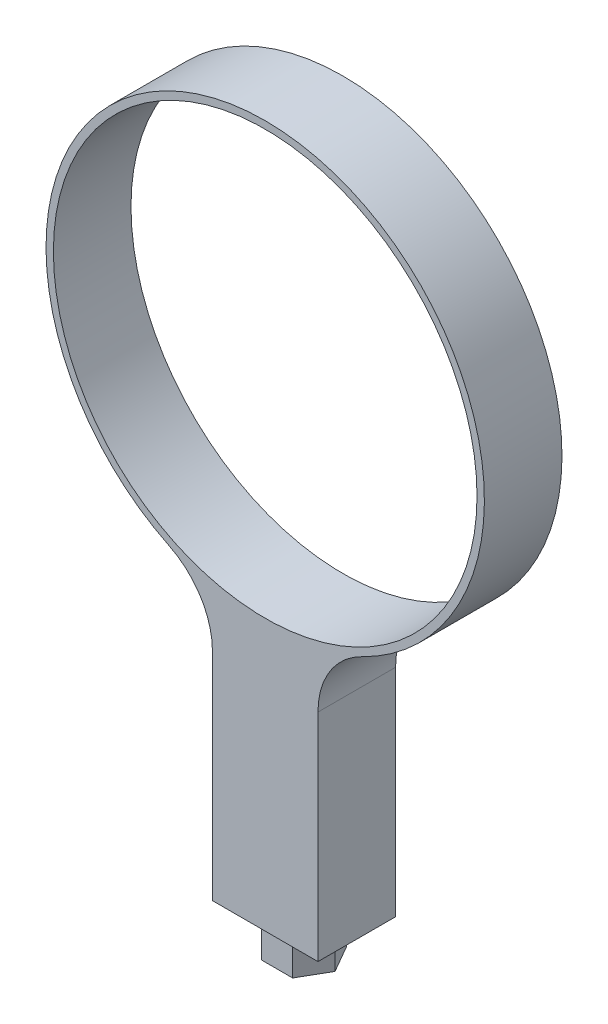
ISO-10303-21;
HEADER;
FILE_DESCRIPTION(('STEP AP214'),'2;1');
FILE_NAME('part.step','',(''),(''),'','','');
FILE_SCHEMA(('AUTOMOTIVE_DESIGN { 1 0 10303 214 1 1 1 1 }'));
ENDSEC;
DATA;
#1=APPLICATION_CONTEXT('core data for automotive mechanical design processes');
#2=APPLICATION_PROTOCOL_DEFINITION('international standard','automotive_design',2000,#1);
#3=PRODUCT_CONTEXT('',#1,'mechanical');
#4=PRODUCT('Part','Part','',(#3));
#5=PRODUCT_RELATED_PRODUCT_CATEGORY('part','',(#4));
#6=PRODUCT_DEFINITION_FORMATION('','',#4);
#7=PRODUCT_DEFINITION_CONTEXT('part definition',#1,'design');
#8=PRODUCT_DEFINITION('design','',#6,#7);
#9=PRODUCT_DEFINITION_SHAPE('','',#8);
#10=(LENGTH_UNIT() NAMED_UNIT(*) SI_UNIT(.MILLI.,.METRE.));
#11=(NAMED_UNIT(*) PLANE_ANGLE_UNIT() SI_UNIT($,.RADIAN.));
#12=(NAMED_UNIT(*) SI_UNIT($,.STERADIAN.) SOLID_ANGLE_UNIT());
#13=UNCERTAINTY_MEASURE_WITH_UNIT(LENGTH_MEASURE(1.E-05),#10,'distance_accuracy_value','');
#14=(GEOMETRIC_REPRESENTATION_CONTEXT(3) GLOBAL_UNCERTAINTY_ASSIGNED_CONTEXT((#13)) GLOBAL_UNIT_ASSIGNED_CONTEXT((#10,
#11,#12)) REPRESENTATION_CONTEXT('',''));
#15=CARTESIAN_POINT('',(0.,0.,0.));
#16=DIRECTION('',(0.,0.,1.));
#17=DIRECTION('',(1.,0.,0.));
#18=AXIS2_PLACEMENT_3D('',#15,#16,#17);
#19=CARTESIAN_POINT('',(0.,-124.425859016769,20.));
#20=DIRECTION('',(0.,1.,0.));
#21=DIRECTION('',(-1.,0.,0.));
#22=AXIS2_PLACEMENT_3D('',#19,#20,#21);
#23=PLANE('',#22);
#24=DIRECTION('',(1.,0.,0.));
#25=VECTOR('',#24,1.);
#26=CARTESIAN_POINT('',(0.,-124.425859016769,0.));
#27=LINE('',#26,#25);
#28=CARTESIAN_POINT('',(-13.6000163937777,-124.425859016769,0.));
#29=VERTEX_POINT('',#28);
#30=CARTESIAN_POINT('',(13.6000163937777,-124.425859016769,0.));
#31=VERTEX_POINT('',#30);
#32=EDGE_CURVE('E206',#29,#31,#27,.T.);
#33=ORIENTED_EDGE('',*,*,#32,.T.);
#34=DIRECTION('',(0.,0.,-1.));
#35=VECTOR('',#34,1.);
#36=CARTESIAN_POINT('',(13.6000163937777,-124.425859016769,20.));
#37=LINE('',#36,#35);
#38=CARTESIAN_POINT('',(13.6000163937777,-124.425859016769,20.));
#39=VERTEX_POINT('',#38);
#40=EDGE_CURVE('E218',#39,#31,#37,.T.);
#41=ORIENTED_EDGE('',*,*,#40,.F.);
#42=DIRECTION('',(1.,0.,0.));
#43=VECTOR('',#42,1.);
#44=CARTESIAN_POINT('',(0.,-124.425859016769,20.));
#45=LINE('',#44,#43);
#46=CARTESIAN_POINT('',(-13.6000163937777,-124.425859016769,20.));
#47=VERTEX_POINT('',#46);
#48=EDGE_CURVE('E184',#47,#39,#45,.T.);
#49=ORIENTED_EDGE('',*,*,#48,.F.);
#50=DIRECTION('',(0.,0.,-1.));
#51=VECTOR('',#50,1.);
#52=CARTESIAN_POINT('',(-13.6000163937777,-124.425859016769,20.));
#53=LINE('',#52,#51);
#54=EDGE_CURVE('E222',#47,#29,#53,.T.);
#55=ORIENTED_EDGE('',*,*,#54,.T.);
#56=EDGE_LOOP('',(#33,#41,#49,#55));
#57=FACE_BOUND('',#56,.T.);
#58=DIRECTION('',(1.,0.,0.));
#59=VECTOR('',#58,1.);
#60=CARTESIAN_POINT('',(0.,-124.425859016769,3.07179676972449));
#61=LINE('',#60,#59);
#62=CARTESIAN_POINT('',(-4.00000000000001,-124.425859016769,3.07179676972449));
#63=VERTEX_POINT('',#62);
#64=CARTESIAN_POINT('',(3.99999999999999,-124.425859016769,3.0717967697245));
#65=VERTEX_POINT('',#64);
#66=EDGE_CURVE('E61',#63,#65,#61,.T.);
#67=ORIENTED_EDGE('',*,*,#66,.F.);
#68=DIRECTION('',(0.5,0.,-0.866025403784438));
#69=VECTOR('',#68,1.);
#70=CARTESIAN_POINT('',(-1.66987298107783,-124.425859016769,-0.96410161513773));
#71=LINE('',#70,#69);
#72=CARTESIAN_POINT('',(-8.00000000000001,-124.425859016769,9.99999999999999));
#73=VERTEX_POINT('',#72);
#74=EDGE_CURVE('E65',#73,#63,#71,.T.);
#75=ORIENTED_EDGE('',*,*,#74,.F.);
#76=DIRECTION('',(-0.499999999999999,0.,-0.866025403784439));
#77=VECTOR('',#76,1.);
#78=CARTESIAN_POINT('',(-10.3301270189222,-124.425859016769,5.96410161513772));
#79=LINE('',#78,#77);
#80=CARTESIAN_POINT('',(-4.00000000000002,-124.425859016769,16.9282032302755));
#81=VERTEX_POINT('',#80);
#82=EDGE_CURVE('E444',#81,#73,#79,.T.);
#83=ORIENTED_EDGE('',*,*,#82,.F.);
#84=DIRECTION('',(-1.,0.,0.));
#85=VECTOR('',#84,1.);
#86=CARTESIAN_POINT('',(0.,-124.425859016769,16.9282032302755));
#87=LINE('',#86,#85);
#88=CARTESIAN_POINT('',(3.99999999999999,-124.425859016769,16.9282032302755));
#89=VERTEX_POINT('',#88);
#90=EDGE_CURVE('E464',#89,#81,#87,.T.);
#91=ORIENTED_EDGE('',*,*,#90,.F.);
#92=DIRECTION('',(-0.5,0.,0.866025403784439));
#93=VECTOR('',#92,1.);
#94=CARTESIAN_POINT('',(10.3301270189222,-124.425859016769,5.96410161513778));
#95=LINE('',#94,#93);
#96=CARTESIAN_POINT('',(7.99999999999998,-124.425859016769,10.));
#97=VERTEX_POINT('',#96);
#98=EDGE_CURVE('E467',#97,#89,#95,.T.);
#99=ORIENTED_EDGE('',*,*,#98,.F.);
#100=DIRECTION('',(0.5,0.,0.866025403784439));
#101=VECTOR('',#100,1.);
#102=CARTESIAN_POINT('',(1.66987298107778,-124.425859016769,-0.964101615137776));
#103=LINE('',#102,#101);
#104=EDGE_CURVE('E469',#65,#97,#103,.T.);
#105=ORIENTED_EDGE('',*,*,#104,.F.);
#106=EDGE_LOOP('',(#67,#75,#83,#91,#99,#105));
#107=FACE_BOUND('',#106,.T.);
#108=ADVANCED_FACE('F45',(#57,#107),#23,.F.);
#109=CARTESIAN_POINT('',(33.6000163937777,-68.7261878641459,20.));
#110=DIRECTION('',(0.,0.,-1.));
#111=DIRECTION('',(-1.,0.,0.));
#112=AXIS2_PLACEMENT_3D('',#109,#110,#111);
#113=CYLINDRICAL_SURFACE('',#112,20.);
#114=CARTESIAN_POINT('',(33.6000163937777,-68.7261878641459,0.));
#115=DIRECTION('',(0.,0.,1.));
#116=DIRECTION('',(1.,0.,0.));
#117=AXIS2_PLACEMENT_3D('',#114,#115,#116);
#118=CIRCLE('',#117,20.);
#119=CARTESIAN_POINT('',(24.8156983823325,-50.7585570499901,0.));
#120=VERTEX_POINT('',#119);
#121=CARTESIAN_POINT('',(13.6000163937777,-68.7261878641459,0.));
#122=VERTEX_POINT('',#121);
#123=EDGE_CURVE('E157',#120,#122,#118,.T.);
#124=ORIENTED_EDGE('',*,*,#123,.F.);
#125=DIRECTION('',(0.,0.,-1.));
#126=VECTOR('',#125,1.);
#127=CARTESIAN_POINT('',(24.8156983823325,-50.7585570499901,20.));
#128=LINE('',#127,#126);
#129=CARTESIAN_POINT('',(24.8156983823325,-50.7585570499901,20.));
#130=VERTEX_POINT('',#129);
#131=EDGE_CURVE('E11',#130,#120,#128,.T.);
#132=ORIENTED_EDGE('',*,*,#131,.F.);
#133=CARTESIAN_POINT('',(33.6000163937777,-68.7261878641459,20.));
#134=DIRECTION('',(0.,0.,1.));
#135=DIRECTION('',(1.,0.,0.));
#136=AXIS2_PLACEMENT_3D('',#133,#134,#135);
#137=CIRCLE('',#136,20.);
#138=CARTESIAN_POINT('',(13.6000163937777,-68.7261878641459,20.));
#139=VERTEX_POINT('',#138);
#140=EDGE_CURVE('E168',#130,#139,#137,.T.);
#141=ORIENTED_EDGE('',*,*,#140,.T.);
#142=DIRECTION('',(0.,0.,-1.));
#143=VECTOR('',#142,1.);
#144=CARTESIAN_POINT('',(13.6000163937777,-68.7261878641459,20.));
#145=LINE('',#144,#143);
#146=EDGE_CURVE('E193',#139,#122,#145,.T.);
#147=ORIENTED_EDGE('',*,*,#146,.T.);
#148=EDGE_LOOP('',(#124,#132,#141,#147));
#149=FACE_BOUND('',#148,.T.);
#150=ADVANCED_FACE('F47',(#149),#113,.F.);
#151=CARTESIAN_POINT('',(0.,0.,20.));
#152=DIRECTION('',(0.,0.,-1.));
#153=DIRECTION('',(-1.,0.,0.));
#154=AXIS2_PLACEMENT_3D('',#151,#152,#153);
#155=CYLINDRICAL_SURFACE('',#154,56.5);
#156=CARTESIAN_POINT('',(0.,0.,0.));
#157=DIRECTION('',(0.,0.,1.));
#158=DIRECTION('',(1.,0.,0.));
#159=AXIS2_PLACEMENT_3D('',#156,#157,#158);
#160=CIRCLE('',#159,56.5);
#161=CARTESIAN_POINT('',(-24.8156983823326,-50.75855704999,0.));
#162=VERTEX_POINT('',#161);
#163=EDGE_CURVE('E162',#120,#162,#160,.T.);
#164=ORIENTED_EDGE('',*,*,#163,.T.);
#165=DIRECTION('',(0.,0.,-1.));
#166=VECTOR('',#165,1.);
#167=CARTESIAN_POINT('',(-24.8156983823326,-50.75855704999,20.));
#168=LINE('',#167,#166);
#169=CARTESIAN_POINT('',(-24.8156983823326,-50.75855704999,20.));
#170=VERTEX_POINT('',#169);
#171=EDGE_CURVE('E54',#170,#162,#168,.T.);
#172=ORIENTED_EDGE('',*,*,#171,.F.);
#173=CARTESIAN_POINT('',(0.,0.,20.));
#174=DIRECTION('',(0.,0.,1.));
#175=DIRECTION('',(1.,0.,0.));
#176=AXIS2_PLACEMENT_3D('',#173,#174,#175);
#177=CIRCLE('',#176,56.5);
#178=EDGE_CURVE('E172',#130,#170,#177,.T.);
#179=ORIENTED_EDGE('',*,*,#178,.F.);
#180=ORIENTED_EDGE('',*,*,#131,.T.);
#181=EDGE_LOOP('',(#164,#172,#179,#180));
#182=FACE_BOUND('',#181,.T.);
#183=ADVANCED_FACE('F236',(#182),#155,.T.);
#184=CARTESIAN_POINT('',(-33.6000163937777,-68.7261878641459,20.));
#185=DIRECTION('',(0.,0.,-1.));
#186=DIRECTION('',(-1.,0.,0.));
#187=AXIS2_PLACEMENT_3D('',#184,#185,#186);
#188=CYLINDRICAL_SURFACE('',#187,20.);
#189=CARTESIAN_POINT('',(-33.6000163937777,-68.7261878641459,0.));
#190=DIRECTION('',(0.,0.,1.));
#191=DIRECTION('',(1.,0.,0.));
#192=AXIS2_PLACEMENT_3D('',#189,#190,#191);
#193=CIRCLE('',#192,20.);
#194=CARTESIAN_POINT('',(-13.6000163937777,-68.7261878641459,0.));
#195=VERTEX_POINT('',#194);
#196=EDGE_CURVE('E198',#195,#162,#193,.T.);
#197=ORIENTED_EDGE('',*,*,#196,.F.);
#198=DIRECTION('',(0.,0.,-1.));
#199=VECTOR('',#198,1.);
#200=CARTESIAN_POINT('',(-13.6000163937777,-68.7261878641459,20.));
#201=LINE('',#200,#199);
#202=CARTESIAN_POINT('',(-13.6000163937777,-68.7261878641459,20.));
#203=VERTEX_POINT('',#202);
#204=EDGE_CURVE('E225',#203,#195,#201,.T.);
#205=ORIENTED_EDGE('',*,*,#204,.F.);
#206=CARTESIAN_POINT('',(-33.6000163937777,-68.7261878641459,20.));
#207=DIRECTION('',(0.,0.,1.));
#208=DIRECTION('',(1.,0.,0.));
#209=AXIS2_PLACEMENT_3D('',#206,#207,#208);
#210=CIRCLE('',#209,20.);
#211=EDGE_CURVE('E176',#203,#170,#210,.T.);
#212=ORIENTED_EDGE('',*,*,#211,.T.);
#213=ORIENTED_EDGE('',*,*,#171,.T.);
#214=EDGE_LOOP('',(#197,#205,#212,#213));
#215=FACE_BOUND('',#214,.T.);
#216=ADVANCED_FACE('F231',(#215),#188,.F.);
#217=CARTESIAN_POINT('',(-13.6000163937777,0.,20.));
#218=DIRECTION('',(-1.,0.,0.));
#219=DIRECTION('',(0.,-1.,0.));
#220=AXIS2_PLACEMENT_3D('',#217,#218,#219);
#221=PLANE('',#220);
#222=DIRECTION('',(0.,1.,0.));
#223=VECTOR('',#222,1.);
#224=CARTESIAN_POINT('',(-13.6000163937777,0.,0.));
#225=LINE('',#224,#223);
#226=EDGE_CURVE('E202',#29,#195,#225,.T.);
#227=ORIENTED_EDGE('',*,*,#226,.F.);
#228=ORIENTED_EDGE('',*,*,#54,.F.);
#229=DIRECTION('',(0.,1.,0.));
#230=VECTOR('',#229,1.);
#231=CARTESIAN_POINT('',(-13.6000163937777,0.,20.));
#232=LINE('',#231,#230);
#233=EDGE_CURVE('E180',#47,#203,#232,.T.);
#234=ORIENTED_EDGE('',*,*,#233,.T.);
#235=ORIENTED_EDGE('',*,*,#204,.T.);
#236=EDGE_LOOP('',(#227,#228,#234,#235));
#237=FACE_BOUND('',#236,.T.);
#238=ADVANCED_FACE('F245',(#237),#221,.T.);
#239=CARTESIAN_POINT('',(13.6000163937777,0.,20.));
#240=DIRECTION('',(-1.,0.,0.));
#241=DIRECTION('',(0.,-1.,0.));
#242=AXIS2_PLACEMENT_3D('',#239,#240,#241);
#243=PLANE('',#242);
#244=DIRECTION('',(0.,1.,0.));
#245=VECTOR('',#244,1.);
#246=CARTESIAN_POINT('',(13.6000163937777,0.,0.));
#247=LINE('',#246,#245);
#248=EDGE_CURVE('E209',#31,#122,#247,.T.);
#249=ORIENTED_EDGE('',*,*,#248,.T.);
#250=ORIENTED_EDGE('',*,*,#146,.F.);
#251=DIRECTION('',(0.,1.,0.));
#252=VECTOR('',#251,1.);
#253=CARTESIAN_POINT('',(13.6000163937777,0.,20.));
#254=LINE('',#253,#252);
#255=EDGE_CURVE('E187',#39,#139,#254,.T.);
#256=ORIENTED_EDGE('',*,*,#255,.F.);
#257=ORIENTED_EDGE('',*,*,#40,.T.);
#258=EDGE_LOOP('',(#249,#250,#256,#257));
#259=FACE_BOUND('',#258,.T.);
#260=ADVANCED_FACE('F256',(#259),#243,.F.);
#261=CARTESIAN_POINT('',(0.,0.,20.));
#262=DIRECTION('',(0.,0.,-1.));
#263=DIRECTION('',(-1.,0.,0.));
#264=AXIS2_PLACEMENT_3D('',#261,#262,#263);
#265=CYLINDRICAL_SURFACE('',#264,54.6);
#266=CARTESIAN_POINT('',(0.,0.,20.));
#267=DIRECTION('',(0.,0.,1.));
#268=DIRECTION('',(1.,0.,0.));
#269=AXIS2_PLACEMENT_3D('',#266,#267,#268);
#270=CIRCLE('',#269,54.6);
#271=CARTESIAN_POINT('',(54.6,0.,20.));
#272=VERTEX_POINT('',#271);
#273=EDGE_CURVE('E190',#272,#272,#270,.T.);
#274=ORIENTED_EDGE('',*,*,#273,.T.);
#275=EDGE_LOOP('',(#274));
#276=FACE_BOUND('',#275,.T.);
#277=CARTESIAN_POINT('',(0.,0.,0.));
#278=DIRECTION('',(0.,0.,1.));
#279=DIRECTION('',(1.,0.,0.));
#280=AXIS2_PLACEMENT_3D('',#277,#278,#279);
#281=CIRCLE('',#280,54.6);
#282=CARTESIAN_POINT('',(54.6,0.,0.));
#283=VERTEX_POINT('',#282);
#284=EDGE_CURVE('E173',#283,#283,#281,.T.);
#285=ORIENTED_EDGE('',*,*,#284,.F.);
#286=EDGE_LOOP('',(#285));
#287=FACE_BOUND('',#286,.T.);
#288=ADVANCED_FACE('F289',(#276,#287),#265,.F.);
#289=CARTESIAN_POINT('',(0.,0.,20.));
#290=DIRECTION('',(0.,0.,1.));
#291=DIRECTION('',(1.,0.,0.));
#292=AXIS2_PLACEMENT_3D('',#289,#290,#291);
#293=PLANE('',#292);
#294=ORIENTED_EDGE('',*,*,#140,.F.);
#295=ORIENTED_EDGE('',*,*,#178,.T.);
#296=ORIENTED_EDGE('',*,*,#211,.F.);
#297=ORIENTED_EDGE('',*,*,#233,.F.);
#298=ORIENTED_EDGE('',*,*,#48,.T.);
#299=ORIENTED_EDGE('',*,*,#255,.T.);
#300=EDGE_LOOP('',(#294,#295,#296,#297,#298,#299));
#301=FACE_BOUND('',#300,.T.);
#302=ORIENTED_EDGE('',*,*,#273,.F.);
#303=EDGE_LOOP('',(#302));
#304=FACE_BOUND('',#303,.T.);
#305=ADVANCED_FACE('F250',(#301,#304),#293,.T.);
#306=CARTESIAN_POINT('',(0.,0.,0.));
#307=DIRECTION('',(0.,0.,1.));
#308=DIRECTION('',(1.,0.,0.));
#309=AXIS2_PLACEMENT_3D('',#306,#307,#308);
#310=PLANE('',#309);
#311=ORIENTED_EDGE('',*,*,#123,.T.);
#312=ORIENTED_EDGE('',*,*,#248,.F.);
#313=ORIENTED_EDGE('',*,*,#32,.F.);
#314=ORIENTED_EDGE('',*,*,#226,.T.);
#315=ORIENTED_EDGE('',*,*,#196,.T.);
#316=ORIENTED_EDGE('',*,*,#163,.F.);
#317=EDGE_LOOP('',(#311,#312,#313,#314,#315,#316));
#318=FACE_BOUND('',#317,.T.);
#319=ORIENTED_EDGE('',*,*,#284,.T.);
#320=EDGE_LOOP('',(#319));
#321=FACE_BOUND('',#320,.T.);
#322=ADVANCED_FACE('F239',(#318,#321),#310,.F.);
#323=CARTESIAN_POINT('',(0.,-134.425859016769,3.07179676972449));
#324=DIRECTION('',(0.,0.,1.));
#325=DIRECTION('',(1.,0.,0.));
#326=AXIS2_PLACEMENT_3D('',#323,#324,#325);
#327=PLANE('',#326);
#328=ORIENTED_EDGE('',*,*,#66,.T.);
#329=DIRECTION('',(0.,1.,0.));
#330=VECTOR('',#329,1.);
#331=CARTESIAN_POINT('',(3.99999999999998,-134.425859016769,3.0717967697245));
#332=LINE('',#331,#330);
#333=CARTESIAN_POINT('',(3.99999999999998,-134.425859016769,3.0717967697245));
#334=VERTEX_POINT('',#333);
#335=EDGE_CURVE('E137',#334,#65,#332,.T.);
#336=ORIENTED_EDGE('',*,*,#335,.F.);
#337=DIRECTION('',(1.,0.,0.));
#338=VECTOR('',#337,1.);
#339=CARTESIAN_POINT('',(0.,-134.425859016769,3.07179676972449));
#340=LINE('',#339,#338);
#341=CARTESIAN_POINT('',(-4.00000000000002,-134.425859016769,3.07179676972449));
#342=VERTEX_POINT('',#341);
#343=EDGE_CURVE('E144',#342,#334,#340,.T.);
#344=ORIENTED_EDGE('',*,*,#343,.F.);
#345=DIRECTION('',(0.,1.,0.));
#346=VECTOR('',#345,1.);
#347=CARTESIAN_POINT('',(-4.00000000000002,-134.425859016769,3.07179676972449));
#348=LINE('',#347,#346);
#349=EDGE_CURVE('E440',#342,#63,#348,.T.);
#350=ORIENTED_EDGE('',*,*,#349,.T.);
#351=EDGE_LOOP('',(#328,#336,#344,#350));
#352=FACE_BOUND('',#351,.T.);
#353=ADVANCED_FACE('F155',(#352),#327,.F.);
#354=CARTESIAN_POINT('',(1.66987298107778,-134.425859016769,-0.964101615137776));
#355=DIRECTION('',(-0.866025403784439,0.,0.5));
#356=DIRECTION('',(0.5,0.,0.866025403784439));
#357=AXIS2_PLACEMENT_3D('',#354,#355,#356);
#358=PLANE('',#357);
#359=ORIENTED_EDGE('',*,*,#104,.T.);
#360=DIRECTION('',(0.,1.,0.));
#361=VECTOR('',#360,1.);
#362=CARTESIAN_POINT('',(7.99999999999998,-134.425859016769,10.));
#363=LINE('',#362,#361);
#364=CARTESIAN_POINT('',(7.99999999999998,-134.425859016769,10.));
#365=VERTEX_POINT('',#364);
#366=EDGE_CURVE('E139',#365,#97,#363,.T.);
#367=ORIENTED_EDGE('',*,*,#366,.F.);
#368=DIRECTION('',(0.5,0.,0.866025403784439));
#369=VECTOR('',#368,1.);
#370=CARTESIAN_POINT('',(1.66987298107778,-134.425859016769,-0.964101615137776));
#371=LINE('',#370,#369);
#372=EDGE_CURVE('E132',#334,#365,#371,.T.);
#373=ORIENTED_EDGE('',*,*,#372,.F.);
#374=ORIENTED_EDGE('',*,*,#335,.T.);
#375=EDGE_LOOP('',(#359,#367,#373,#374));
#376=FACE_BOUND('',#375,.T.);
#377=ADVANCED_FACE('F135',(#376),#358,.F.);
#378=CARTESIAN_POINT('',(10.3301270189222,-134.425859016769,5.96410161513778));
#379=DIRECTION('',(-0.866025403784439,0.,-0.5));
#380=DIRECTION('',(-0.5,0.,0.866025403784439));
#381=AXIS2_PLACEMENT_3D('',#378,#379,#380);
#382=PLANE('',#381);
#383=ORIENTED_EDGE('',*,*,#98,.T.);
#384=DIRECTION('',(0.,1.,0.));
#385=VECTOR('',#384,1.);
#386=CARTESIAN_POINT('',(3.99999999999998,-134.425859016769,16.9282032302755));
#387=LINE('',#386,#385);
#388=CARTESIAN_POINT('',(3.99999999999998,-134.425859016769,16.9282032302755));
#389=VERTEX_POINT('',#388);
#390=EDGE_CURVE('E164',#389,#89,#387,.T.);
#391=ORIENTED_EDGE('',*,*,#390,.F.);
#392=DIRECTION('',(-0.5,0.,0.866025403784439));
#393=VECTOR('',#392,1.);
#394=CARTESIAN_POINT('',(10.3301270189222,-134.425859016769,5.96410161513778));
#395=LINE('',#394,#393);
#396=EDGE_CURVE('E143',#365,#389,#395,.T.);
#397=ORIENTED_EDGE('',*,*,#396,.F.);
#398=ORIENTED_EDGE('',*,*,#366,.T.);
#399=EDGE_LOOP('',(#383,#391,#397,#398));
#400=FACE_BOUND('',#399,.T.);
#401=ADVANCED_FACE('F319',(#400),#382,.F.);
#402=CARTESIAN_POINT('',(0.,-134.425859016769,16.9282032302755));
#403=DIRECTION('',(0.,0.,-1.));
#404=DIRECTION('',(-1.,0.,0.));
#405=AXIS2_PLACEMENT_3D('',#402,#403,#404);
#406=PLANE('',#405);
#407=ORIENTED_EDGE('',*,*,#90,.T.);
#408=DIRECTION('',(0.,1.,0.));
#409=VECTOR('',#408,1.);
#410=CARTESIAN_POINT('',(-4.00000000000002,-134.425859016769,16.9282032302755));
#411=LINE('',#410,#409);
#412=CARTESIAN_POINT('',(-4.00000000000002,-134.425859016769,16.9282032302755));
#413=VERTEX_POINT('',#412);
#414=EDGE_CURVE('E450',#413,#81,#411,.T.);
#415=ORIENTED_EDGE('',*,*,#414,.F.);
#416=DIRECTION('',(-1.,0.,0.));
#417=VECTOR('',#416,1.);
#418=CARTESIAN_POINT('',(0.,-134.425859016769,16.9282032302755));
#419=LINE('',#418,#417);
#420=EDGE_CURVE('E465',#389,#413,#419,.T.);
#421=ORIENTED_EDGE('',*,*,#420,.F.);
#422=ORIENTED_EDGE('',*,*,#390,.T.);
#423=EDGE_LOOP('',(#407,#415,#421,#422));
#424=FACE_BOUND('',#423,.T.);
#425=ADVANCED_FACE('F326',(#424),#406,.F.);
#426=CARTESIAN_POINT('',(-10.3301270189222,-134.425859016769,5.96410161513772));
#427=DIRECTION('',(0.866025403784439,0.,-0.499999999999999));
#428=DIRECTION('',(-0.499999999999999,0.,-0.866025403784439));
#429=AXIS2_PLACEMENT_3D('',#426,#427,#428);
#430=PLANE('',#429);
#431=ORIENTED_EDGE('',*,*,#82,.T.);
#432=DIRECTION('',(0.,1.,0.));
#433=VECTOR('',#432,1.);
#434=CARTESIAN_POINT('',(-8.00000000000001,-134.425859016769,9.99999999999999));
#435=LINE('',#434,#433);
#436=CARTESIAN_POINT('',(-8.00000000000001,-134.425859016769,9.99999999999999));
#437=VERTEX_POINT('',#436);
#438=EDGE_CURVE('E442',#437,#73,#435,.T.);
#439=ORIENTED_EDGE('',*,*,#438,.F.);
#440=DIRECTION('',(-0.499999999999999,0.,-0.866025403784439));
#441=VECTOR('',#440,1.);
#442=CARTESIAN_POINT('',(-10.3301270189222,-134.425859016769,5.96410161513772));
#443=LINE('',#442,#441);
#444=EDGE_CURVE('E452',#413,#437,#443,.T.);
#445=ORIENTED_EDGE('',*,*,#444,.F.);
#446=ORIENTED_EDGE('',*,*,#414,.T.);
#447=EDGE_LOOP('',(#431,#439,#445,#446));
#448=FACE_BOUND('',#447,.T.);
#449=ADVANCED_FACE('F334',(#448),#430,.F.);
#450=CARTESIAN_POINT('',(-1.66987298107783,-134.425859016769,-0.96410161513773));
#451=DIRECTION('',(0.866025403784438,0.,0.5));
#452=DIRECTION('',(0.5,0.,-0.866025403784438));
#453=AXIS2_PLACEMENT_3D('',#450,#451,#452);
#454=PLANE('',#453);
#455=ORIENTED_EDGE('',*,*,#74,.T.);
#456=ORIENTED_EDGE('',*,*,#349,.F.);
#457=DIRECTION('',(0.5,0.,-0.866025403784438));
#458=VECTOR('',#457,1.);
#459=CARTESIAN_POINT('',(-1.66987298107783,-134.425859016769,-0.96410161513773));
#460=LINE('',#459,#458);
#461=EDGE_CURVE('E149',#437,#342,#460,.T.);
#462=ORIENTED_EDGE('',*,*,#461,.F.);
#463=ORIENTED_EDGE('',*,*,#438,.T.);
#464=EDGE_LOOP('',(#455,#456,#462,#463));
#465=FACE_BOUND('',#464,.T.);
#466=ADVANCED_FACE('F342',(#465),#454,.F.);
#467=CARTESIAN_POINT('',(0.,-134.425859016769,0.));
#468=DIRECTION('',(0.,-1.,0.));
#469=DIRECTION('',(1.,0.,0.));
#470=AXIS2_PLACEMENT_3D('',#467,#468,#469);
#471=PLANE('',#470);
#472=ORIENTED_EDGE('',*,*,#343,.T.);
#473=ORIENTED_EDGE('',*,*,#372,.T.);
#474=ORIENTED_EDGE('',*,*,#396,.T.);
#475=ORIENTED_EDGE('',*,*,#420,.T.);
#476=ORIENTED_EDGE('',*,*,#444,.T.);
#477=ORIENTED_EDGE('',*,*,#461,.T.);
#478=EDGE_LOOP('',(#472,#473,#474,#475,#476,#477));
#479=FACE_BOUND('',#478,.T.);
#480=ADVANCED_FACE('F147',(#479),#471,.T.);
#481=CLOSED_SHELL('',(#108,#150,#183,#216,#238,#260,#288,#305,#322,#353,#377,#401,#425,#449,
#466,#480));
#482=MANIFOLD_SOLID_BREP('B2',#481);
#483=ADVANCED_BREP_SHAPE_REPRESENTATION('',(#18,#482),#14);
#484=SHAPE_DEFINITION_REPRESENTATION(#9,#483);
ENDSEC;
END-ISO-10303-21;
